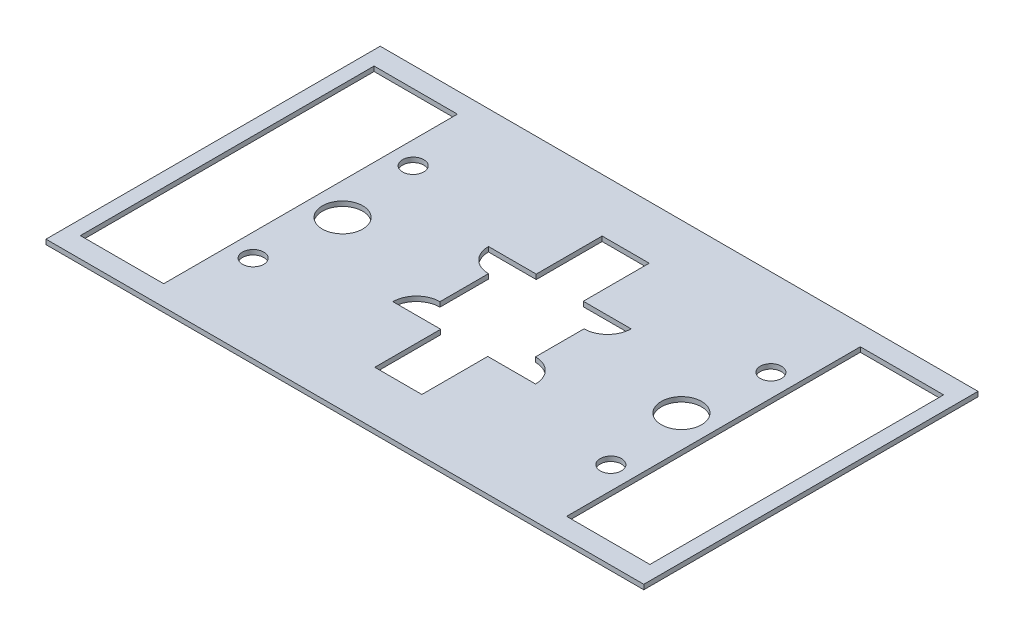
ISO-10303-21;
HEADER;
FILE_DESCRIPTION(('STEP AP214'),'2;1');
FILE_NAME('part.step','',(''),(''),'','','');
FILE_SCHEMA(('AUTOMOTIVE_DESIGN { 1 0 10303 214 1 1 1 1 }'));
ENDSEC;
DATA;
#1=APPLICATION_CONTEXT('core data for automotive mechanical design processes');
#2=APPLICATION_PROTOCOL_DEFINITION('international standard','automotive_design',2000,#1);
#3=PRODUCT_CONTEXT('',#1,'mechanical');
#4=PRODUCT('Part','Part','',(#3));
#5=PRODUCT_RELATED_PRODUCT_CATEGORY('part','',(#4));
#6=PRODUCT_DEFINITION_FORMATION('','',#4);
#7=PRODUCT_DEFINITION_CONTEXT('part definition',#1,'design');
#8=PRODUCT_DEFINITION('design','',#6,#7);
#9=PRODUCT_DEFINITION_SHAPE('','',#8);
#10=(LENGTH_UNIT() NAMED_UNIT(*) SI_UNIT(.MILLI.,.METRE.));
#11=(NAMED_UNIT(*) PLANE_ANGLE_UNIT() SI_UNIT($,.RADIAN.));
#12=(NAMED_UNIT(*) SI_UNIT($,.STERADIAN.) SOLID_ANGLE_UNIT());
#13=UNCERTAINTY_MEASURE_WITH_UNIT(LENGTH_MEASURE(1.E-05),#10,'distance_accuracy_value','');
#14=(GEOMETRIC_REPRESENTATION_CONTEXT(3) GLOBAL_UNCERTAINTY_ASSIGNED_CONTEXT((#13)) GLOBAL_UNIT_ASSIGNED_CONTEXT((#10,
#11,#12)) REPRESENTATION_CONTEXT('',''));
#15=CARTESIAN_POINT('',(0.,0.,0.));
#16=DIRECTION('',(0.,0.,1.));
#17=DIRECTION('',(1.,0.,0.));
#18=AXIS2_PLACEMENT_3D('',#15,#16,#17);
#19=CARTESIAN_POINT('',(0.,0.508,-15.6));
#20=DIRECTION('',(0.,0.,-1.));
#21=DIRECTION('',(-1.,0.,0.));
#22=AXIS2_PLACEMENT_3D('',#19,#20,#21);
#23=PLANE('',#22);
#24=DIRECTION('',(1.,0.,0.));
#25=VECTOR('',#24,1.);
#26=CARTESIAN_POINT('',(0.,0.,-15.6));
#27=LINE('',#26,#25);
#28=CARTESIAN_POINT('',(21.4,0.,-15.6));
#29=VERTEX_POINT('',#28);
#30=CARTESIAN_POINT('',(30.25,0.,-15.6));
#31=VERTEX_POINT('',#30);
#32=EDGE_CURVE('E337',#29,#31,#27,.T.);
#33=ORIENTED_EDGE('',*,*,#32,.T.);
#34=DIRECTION('',(0.,-1.,0.));
#35=VECTOR('',#34,1.);
#36=CARTESIAN_POINT('',(30.25,0.508,-15.6));
#37=LINE('',#36,#35);
#38=CARTESIAN_POINT('',(30.25,0.508,-15.6));
#39=VERTEX_POINT('',#38);
#40=EDGE_CURVE('E11',#39,#31,#37,.T.);
#41=ORIENTED_EDGE('',*,*,#40,.F.);
#42=DIRECTION('',(1.,0.,0.));
#43=VECTOR('',#42,1.);
#44=CARTESIAN_POINT('',(0.,0.508,-15.6));
#45=LINE('',#44,#43);
#46=CARTESIAN_POINT('',(21.4,0.508,-15.6));
#47=VERTEX_POINT('',#46);
#48=EDGE_CURVE('E234',#47,#39,#45,.T.);
#49=ORIENTED_EDGE('',*,*,#48,.F.);
#50=DIRECTION('',(0.,-1.,0.));
#51=VECTOR('',#50,1.);
#52=CARTESIAN_POINT('',(21.4,0.508,-15.6));
#53=LINE('',#52,#51);
#54=EDGE_CURVE('E54',#47,#29,#53,.T.);
#55=ORIENTED_EDGE('',*,*,#54,.T.);
#56=EDGE_LOOP('',(#33,#41,#49,#55));
#57=FACE_BOUND('',#56,.T.);
#58=ADVANCED_FACE('F35',(#57),#23,.F.);
#59=CARTESIAN_POINT('',(30.25,0.508,0.));
#60=DIRECTION('',(1.,0.,0.));
#61=DIRECTION('',(0.,0.,-1.));
#62=AXIS2_PLACEMENT_3D('',#59,#60,#61);
#63=PLANE('',#62);
#64=DIRECTION('',(0.,0.,1.));
#65=VECTOR('',#64,1.);
#66=CARTESIAN_POINT('',(30.25,0.,0.));
#67=LINE('',#66,#65);
#68=CARTESIAN_POINT('',(30.25,0.,15.6));
#69=VERTEX_POINT('',#68);
#70=EDGE_CURVE('E240',#31,#69,#67,.T.);
#71=ORIENTED_EDGE('',*,*,#70,.T.);
#72=DIRECTION('',(0.,-1.,0.));
#73=VECTOR('',#72,1.);
#74=CARTESIAN_POINT('',(30.25,0.508,15.6));
#75=LINE('',#74,#73);
#76=CARTESIAN_POINT('',(30.25,0.508,15.6));
#77=VERTEX_POINT('',#76);
#78=EDGE_CURVE('E45',#77,#69,#75,.T.);
#79=ORIENTED_EDGE('',*,*,#78,.F.);
#80=DIRECTION('',(0.,0.,1.));
#81=VECTOR('',#80,1.);
#82=CARTESIAN_POINT('',(30.25,0.508,0.));
#83=LINE('',#82,#81);
#84=EDGE_CURVE('E228',#39,#77,#83,.T.);
#85=ORIENTED_EDGE('',*,*,#84,.F.);
#86=ORIENTED_EDGE('',*,*,#40,.T.);
#87=EDGE_LOOP('',(#71,#79,#85,#86));
#88=FACE_BOUND('',#87,.T.);
#89=ADVANCED_FACE('F239',(#88),#63,.F.);
#90=CARTESIAN_POINT('',(0.,0.508,15.6));
#91=DIRECTION('',(0.,0.,-1.));
#92=DIRECTION('',(-1.,0.,0.));
#93=AXIS2_PLACEMENT_3D('',#90,#91,#92);
#94=PLANE('',#93);
#95=DIRECTION('',(1.,0.,0.));
#96=VECTOR('',#95,1.);
#97=CARTESIAN_POINT('',(0.,0.,15.6));
#98=LINE('',#97,#96);
#99=CARTESIAN_POINT('',(21.4,0.,15.6));
#100=VERTEX_POINT('',#99);
#101=EDGE_CURVE('E340',#100,#69,#98,.T.);
#102=ORIENTED_EDGE('',*,*,#101,.F.);
#103=DIRECTION('',(0.,-1.,0.));
#104=VECTOR('',#103,1.);
#105=CARTESIAN_POINT('',(21.4,0.508,15.6));
#106=LINE('',#105,#104);
#107=CARTESIAN_POINT('',(21.4,0.508,15.6));
#108=VERTEX_POINT('',#107);
#109=EDGE_CURVE('E140',#108,#100,#106,.T.);
#110=ORIENTED_EDGE('',*,*,#109,.F.);
#111=DIRECTION('',(1.,0.,0.));
#112=VECTOR('',#111,1.);
#113=CARTESIAN_POINT('',(0.,0.508,15.6));
#114=LINE('',#113,#112);
#115=EDGE_CURVE('E233',#108,#77,#114,.T.);
#116=ORIENTED_EDGE('',*,*,#115,.T.);
#117=ORIENTED_EDGE('',*,*,#78,.T.);
#118=EDGE_LOOP('',(#102,#110,#116,#117));
#119=FACE_BOUND('',#118,.T.);
#120=ADVANCED_FACE('F244',(#119),#94,.T.);
#121=CARTESIAN_POINT('',(0.,0.508,-15.6));
#122=DIRECTION('',(0.,0.,-1.));
#123=DIRECTION('',(-1.,0.,0.));
#124=AXIS2_PLACEMENT_3D('',#121,#122,#123);
#125=PLANE('',#124);
#126=DIRECTION('',(1.,0.,0.));
#127=VECTOR('',#126,1.);
#128=CARTESIAN_POINT('',(0.,0.,-15.6));
#129=LINE('',#128,#127);
#130=CARTESIAN_POINT('',(-30.25,0.,-15.6));
#131=VERTEX_POINT('',#130);
#132=CARTESIAN_POINT('',(-21.4,0.,-15.6));
#133=VERTEX_POINT('',#132);
#134=EDGE_CURVE('E325',#131,#133,#129,.T.);
#135=ORIENTED_EDGE('',*,*,#134,.T.);
#136=DIRECTION('',(0.,-1.,0.));
#137=VECTOR('',#136,1.);
#138=CARTESIAN_POINT('',(-21.4,0.508,-15.6));
#139=LINE('',#138,#137);
#140=CARTESIAN_POINT('',(-21.4,0.508,-15.6));
#141=VERTEX_POINT('',#140);
#142=EDGE_CURVE('E347',#141,#133,#139,.T.);
#143=ORIENTED_EDGE('',*,*,#142,.F.);
#144=DIRECTION('',(1.,0.,0.));
#145=VECTOR('',#144,1.);
#146=CARTESIAN_POINT('',(0.,0.508,-15.6));
#147=LINE('',#146,#145);
#148=CARTESIAN_POINT('',(-30.25,0.508,-15.6));
#149=VERTEX_POINT('',#148);
#150=EDGE_CURVE('E486',#149,#141,#147,.T.);
#151=ORIENTED_EDGE('',*,*,#150,.F.);
#152=DIRECTION('',(0.,-1.,0.));
#153=VECTOR('',#152,1.);
#154=CARTESIAN_POINT('',(-30.25,0.508,-15.6));
#155=LINE('',#154,#153);
#156=EDGE_CURVE('E349',#149,#131,#155,.T.);
#157=ORIENTED_EDGE('',*,*,#156,.T.);
#158=EDGE_LOOP('',(#135,#143,#151,#157));
#159=FACE_BOUND('',#158,.T.);
#160=ADVANCED_FACE('F512',(#159),#125,.F.);
#161=CARTESIAN_POINT('',(-21.4,0.508,0.));
#162=DIRECTION('',(1.,0.,0.));
#163=DIRECTION('',(0.,0.,-1.));
#164=AXIS2_PLACEMENT_3D('',#161,#162,#163);
#165=PLANE('',#164);
#166=DIRECTION('',(0.,0.,1.));
#167=VECTOR('',#166,1.);
#168=CARTESIAN_POINT('',(-21.4,0.,0.));
#169=LINE('',#168,#167);
#170=CARTESIAN_POINT('',(-21.4,0.,15.6));
#171=VERTEX_POINT('',#170);
#172=EDGE_CURVE('E328',#133,#171,#169,.T.);
#173=ORIENTED_EDGE('',*,*,#172,.T.);
#174=DIRECTION('',(0.,-1.,0.));
#175=VECTOR('',#174,1.);
#176=CARTESIAN_POINT('',(-21.4,0.508,15.6));
#177=LINE('',#176,#175);
#178=CARTESIAN_POINT('',(-21.4,0.508,15.6));
#179=VERTEX_POINT('',#178);
#180=EDGE_CURVE('E354',#179,#171,#177,.T.);
#181=ORIENTED_EDGE('',*,*,#180,.F.);
#182=DIRECTION('',(0.,0.,1.));
#183=VECTOR('',#182,1.);
#184=CARTESIAN_POINT('',(-21.4,0.508,0.));
#185=LINE('',#184,#183);
#186=EDGE_CURVE('E489',#141,#179,#185,.T.);
#187=ORIENTED_EDGE('',*,*,#186,.F.);
#188=ORIENTED_EDGE('',*,*,#142,.T.);
#189=EDGE_LOOP('',(#173,#181,#187,#188));
#190=FACE_BOUND('',#189,.T.);
#191=ADVANCED_FACE('F514',(#190),#165,.F.);
#192=CARTESIAN_POINT('',(0.,0.508,15.6));
#193=DIRECTION('',(0.,0.,-1.));
#194=DIRECTION('',(-1.,0.,0.));
#195=AXIS2_PLACEMENT_3D('',#192,#193,#194);
#196=PLANE('',#195);
#197=DIRECTION('',(1.,0.,0.));
#198=VECTOR('',#197,1.);
#199=CARTESIAN_POINT('',(0.,0.,15.6));
#200=LINE('',#199,#198);
#201=CARTESIAN_POINT('',(-30.25,0.,15.6));
#202=VERTEX_POINT('',#201);
#203=EDGE_CURVE('E331',#202,#171,#200,.T.);
#204=ORIENTED_EDGE('',*,*,#203,.F.);
#205=DIRECTION('',(0.,-1.,0.));
#206=VECTOR('',#205,1.);
#207=CARTESIAN_POINT('',(-30.25,0.508,15.6));
#208=LINE('',#207,#206);
#209=CARTESIAN_POINT('',(-30.25,0.508,15.6));
#210=VERTEX_POINT('',#209);
#211=EDGE_CURVE('E351',#210,#202,#208,.T.);
#212=ORIENTED_EDGE('',*,*,#211,.F.);
#213=DIRECTION('',(1.,0.,0.));
#214=VECTOR('',#213,1.);
#215=CARTESIAN_POINT('',(0.,0.508,15.6));
#216=LINE('',#215,#214);
#217=EDGE_CURVE('E491',#210,#179,#216,.T.);
#218=ORIENTED_EDGE('',*,*,#217,.T.);
#219=ORIENTED_EDGE('',*,*,#180,.T.);
#220=EDGE_LOOP('',(#204,#212,#218,#219));
#221=FACE_BOUND('',#220,.T.);
#222=ADVANCED_FACE('F507',(#221),#196,.T.);
#223=CARTESIAN_POINT('',(31.75,0.508,0.));
#224=DIRECTION('',(1.,0.,0.));
#225=DIRECTION('',(0.,0.,-1.));
#226=AXIS2_PLACEMENT_3D('',#223,#224,#225);
#227=PLANE('',#226);
#228=DIRECTION('',(0.,0.,1.));
#229=VECTOR('',#228,1.);
#230=CARTESIAN_POINT('',(31.75,0.,0.));
#231=LINE('',#230,#229);
#232=CARTESIAN_POINT('',(31.75,0.,-17.75));
#233=VERTEX_POINT('',#232);
#234=CARTESIAN_POINT('',(31.75,0.,17.75));
#235=VERTEX_POINT('',#234);
#236=EDGE_CURVE('E313',#233,#235,#231,.T.);
#237=ORIENTED_EDGE('',*,*,#236,.F.);
#238=DIRECTION('',(0.,-1.,0.));
#239=VECTOR('',#238,1.);
#240=CARTESIAN_POINT('',(31.75,0.508,-17.75));
#241=LINE('',#240,#239);
#242=CARTESIAN_POINT('',(31.75,0.508,-17.75));
#243=VERTEX_POINT('',#242);
#244=EDGE_CURVE('E352',#243,#233,#241,.T.);
#245=ORIENTED_EDGE('',*,*,#244,.F.);
#246=DIRECTION('',(0.,0.,1.));
#247=VECTOR('',#246,1.);
#248=CARTESIAN_POINT('',(31.75,0.508,0.));
#249=LINE('',#248,#247);
#250=CARTESIAN_POINT('',(31.75,0.508,17.75));
#251=VERTEX_POINT('',#250);
#252=EDGE_CURVE('E475',#243,#251,#249,.T.);
#253=ORIENTED_EDGE('',*,*,#252,.T.);
#254=DIRECTION('',(0.,-1.,0.));
#255=VECTOR('',#254,1.);
#256=CARTESIAN_POINT('',(31.75,0.508,17.75));
#257=LINE('',#256,#255);
#258=EDGE_CURVE('E358',#251,#235,#257,.T.);
#259=ORIENTED_EDGE('',*,*,#258,.T.);
#260=EDGE_LOOP('',(#237,#245,#253,#259));
#261=FACE_BOUND('',#260,.T.);
#262=ADVANCED_FACE('F521',(#261),#227,.T.);
#263=CARTESIAN_POINT('',(0.,0.508,-17.75));
#264=DIRECTION('',(0.,0.,-1.));
#265=DIRECTION('',(-1.,0.,0.));
#266=AXIS2_PLACEMENT_3D('',#263,#264,#265);
#267=PLANE('',#266);
#268=DIRECTION('',(1.,0.,0.));
#269=VECTOR('',#268,1.);
#270=CARTESIAN_POINT('',(0.,0.,-17.75));
#271=LINE('',#270,#269);
#272=CARTESIAN_POINT('',(-31.75,0.,-17.75));
#273=VERTEX_POINT('',#272);
#274=EDGE_CURVE('E316',#273,#233,#271,.T.);
#275=ORIENTED_EDGE('',*,*,#274,.F.);
#276=DIRECTION('',(0.,-1.,0.));
#277=VECTOR('',#276,1.);
#278=CARTESIAN_POINT('',(-31.75,0.508,-17.75));
#279=LINE('',#278,#277);
#280=CARTESIAN_POINT('',(-31.75,0.508,-17.75));
#281=VERTEX_POINT('',#280);
#282=EDGE_CURVE('E363',#281,#273,#279,.T.);
#283=ORIENTED_EDGE('',*,*,#282,.F.);
#284=DIRECTION('',(1.,0.,0.));
#285=VECTOR('',#284,1.);
#286=CARTESIAN_POINT('',(0.,0.508,-17.75));
#287=LINE('',#286,#285);
#288=EDGE_CURVE('E478',#281,#243,#287,.T.);
#289=ORIENTED_EDGE('',*,*,#288,.T.);
#290=ORIENTED_EDGE('',*,*,#244,.T.);
#291=EDGE_LOOP('',(#275,#283,#289,#290));
#292=FACE_BOUND('',#291,.T.);
#293=ADVANCED_FACE('F602',(#292),#267,.T.);
#294=CARTESIAN_POINT('',(-31.75,0.508,0.));
#295=DIRECTION('',(1.,0.,0.));
#296=DIRECTION('',(0.,0.,-1.));
#297=AXIS2_PLACEMENT_3D('',#294,#295,#296);
#298=PLANE('',#297);
#299=DIRECTION('',(0.,0.,1.));
#300=VECTOR('',#299,1.);
#301=CARTESIAN_POINT('',(-31.75,0.,0.));
#302=LINE('',#301,#300);
#303=CARTESIAN_POINT('',(-31.75,0.,17.75));
#304=VERTEX_POINT('',#303);
#305=EDGE_CURVE('E319',#273,#304,#302,.T.);
#306=ORIENTED_EDGE('',*,*,#305,.T.);
#307=DIRECTION('',(0.,-1.,0.));
#308=VECTOR('',#307,1.);
#309=CARTESIAN_POINT('',(-31.75,0.508,17.75));
#310=LINE('',#309,#308);
#311=CARTESIAN_POINT('',(-31.75,0.508,17.75));
#312=VERTEX_POINT('',#311);
#313=EDGE_CURVE('E360',#312,#304,#310,.T.);
#314=ORIENTED_EDGE('',*,*,#313,.F.);
#315=DIRECTION('',(0.,0.,1.));
#316=VECTOR('',#315,1.);
#317=CARTESIAN_POINT('',(-31.75,0.508,0.));
#318=LINE('',#317,#316);
#319=EDGE_CURVE('E481',#281,#312,#318,.T.);
#320=ORIENTED_EDGE('',*,*,#319,.F.);
#321=ORIENTED_EDGE('',*,*,#282,.T.);
#322=EDGE_LOOP('',(#306,#314,#320,#321));
#323=FACE_BOUND('',#322,.T.);
#324=ADVANCED_FACE('F598',(#323),#298,.F.);
#325=CARTESIAN_POINT('',(0.,0.508,5.075));
#326=DIRECTION('',(0.,0.,-1.));
#327=DIRECTION('',(-1.,0.,0.));
#328=AXIS2_PLACEMENT_3D('',#325,#326,#327);
#329=PLANE('',#328);
#330=DIRECTION('',(1.,0.,0.));
#331=VECTOR('',#330,1.);
#332=CARTESIAN_POINT('',(0.,0.,5.075));
#333=LINE('',#332,#331);
#334=CARTESIAN_POINT('',(-7.575,0.,5.075));
#335=VERTEX_POINT('',#334);
#336=CARTESIAN_POINT('',(-2.5,0.,5.075));
#337=VERTEX_POINT('',#336);
#338=EDGE_CURVE('E251',#335,#337,#333,.T.);
#339=ORIENTED_EDGE('',*,*,#338,.F.);
#340=DIRECTION('',(0.,-1.,0.));
#341=VECTOR('',#340,1.);
#342=CARTESIAN_POINT('',(-7.575,0.508,5.075));
#343=LINE('',#342,#341);
#344=CARTESIAN_POINT('',(-7.575,0.508,5.075));
#345=VERTEX_POINT('',#344);
#346=EDGE_CURVE('E39',#345,#335,#343,.T.);
#347=ORIENTED_EDGE('',*,*,#346,.F.);
#348=DIRECTION('',(1.,0.,0.));
#349=VECTOR('',#348,1.);
#350=CARTESIAN_POINT('',(0.,0.508,5.075));
#351=LINE('',#350,#349);
#352=CARTESIAN_POINT('',(-2.5,0.508,5.075));
#353=VERTEX_POINT('',#352);
#354=EDGE_CURVE('E345',#345,#353,#351,.T.);
#355=ORIENTED_EDGE('',*,*,#354,.T.);
#356=DIRECTION('',(0.,-1.,0.));
#357=VECTOR('',#356,1.);
#358=CARTESIAN_POINT('',(-2.5,0.508,5.075));
#359=LINE('',#358,#357);
#360=EDGE_CURVE('E247',#353,#337,#359,.T.);
#361=ORIENTED_EDGE('',*,*,#360,.T.);
#362=EDGE_LOOP('',(#339,#347,#355,#361));
#363=FACE_BOUND('',#362,.T.);
#364=ADVANCED_FACE('F37',(#363),#329,.T.);
#365=CARTESIAN_POINT('',(-5.075,0.508,5.075));
#366=DIRECTION('',(0.,-1.,0.));
#367=DIRECTION('',(0.,0.,-1.));
#368=AXIS2_PLACEMENT_3D('',#365,#366,#367);
#369=CYLINDRICAL_SURFACE('',#368,2.5);
#370=CARTESIAN_POINT('',(-5.075,0.,5.075));
#371=DIRECTION('',(0.,1.,0.));
#372=DIRECTION('',(0.,0.,1.));
#373=AXIS2_PLACEMENT_3D('',#370,#371,#372);
#374=CIRCLE('',#373,2.5);
#375=CARTESIAN_POINT('',(-5.075,0.,2.575));
#376=VERTEX_POINT('',#375);
#377=EDGE_CURVE('E254',#376,#335,#374,.T.);
#378=ORIENTED_EDGE('',*,*,#377,.F.);
#379=DIRECTION('',(0.,-1.,0.));
#380=VECTOR('',#379,1.);
#381=CARTESIAN_POINT('',(-5.075,0.508,2.575));
#382=LINE('',#381,#380);
#383=CARTESIAN_POINT('',(-5.075,0.508,2.575));
#384=VERTEX_POINT('',#383);
#385=EDGE_CURVE('E396',#384,#376,#382,.T.);
#386=ORIENTED_EDGE('',*,*,#385,.F.);
#387=CARTESIAN_POINT('',(-5.075,0.508,5.075));
#388=DIRECTION('',(0.,1.,0.));
#389=DIRECTION('',(0.,0.,1.));
#390=AXIS2_PLACEMENT_3D('',#387,#388,#389);
#391=CIRCLE('',#390,2.5);
#392=EDGE_CURVE('E405',#384,#345,#391,.T.);
#393=ORIENTED_EDGE('',*,*,#392,.T.);
#394=ORIENTED_EDGE('',*,*,#346,.T.);
#395=EDGE_LOOP('',(#378,#386,#393,#394));
#396=FACE_BOUND('',#395,.T.);
#397=ADVANCED_FACE('F403',(#396),#369,.F.);
#398=CARTESIAN_POINT('',(-5.075,0.508,0.));
#399=DIRECTION('',(1.,0.,0.));
#400=DIRECTION('',(0.,0.,-1.));
#401=AXIS2_PLACEMENT_3D('',#398,#399,#400);
#402=PLANE('',#401);
#403=DIRECTION('',(0.,0.,1.));
#404=VECTOR('',#403,1.);
#405=CARTESIAN_POINT('',(-5.075,0.,0.));
#406=LINE('',#405,#404);
#407=CARTESIAN_POINT('',(-5.075,0.,-2.575));
#408=VERTEX_POINT('',#407);
#409=EDGE_CURVE('E257',#408,#376,#406,.T.);
#410=ORIENTED_EDGE('',*,*,#409,.F.);
#411=DIRECTION('',(0.,-1.,0.));
#412=VECTOR('',#411,1.);
#413=CARTESIAN_POINT('',(-5.075,0.508,-2.575));
#414=LINE('',#413,#412);
#415=CARTESIAN_POINT('',(-5.075,0.508,-2.575));
#416=VERTEX_POINT('',#415);
#417=EDGE_CURVE('E395',#416,#408,#414,.T.);
#418=ORIENTED_EDGE('',*,*,#417,.F.);
#419=DIRECTION('',(0.,0.,1.));
#420=VECTOR('',#419,1.);
#421=CARTESIAN_POINT('',(-5.075,0.508,0.));
#422=LINE('',#421,#420);
#423=EDGE_CURVE('E414',#416,#384,#422,.T.);
#424=ORIENTED_EDGE('',*,*,#423,.T.);
#425=ORIENTED_EDGE('',*,*,#385,.T.);
#426=EDGE_LOOP('',(#410,#418,#424,#425));
#427=FACE_BOUND('',#426,.T.);
#428=ADVANCED_FACE('F412',(#427),#402,.T.);
#429=CARTESIAN_POINT('',(-5.075,0.508,-5.075));
#430=DIRECTION('',(0.,-1.,0.));
#431=DIRECTION('',(0.,0.,-1.));
#432=AXIS2_PLACEMENT_3D('',#429,#430,#431);
#433=CYLINDRICAL_SURFACE('',#432,2.5);
#434=CARTESIAN_POINT('',(-5.075,0.,-5.075));
#435=DIRECTION('',(0.,1.,0.));
#436=DIRECTION('',(0.,0.,1.));
#437=AXIS2_PLACEMENT_3D('',#434,#435,#436);
#438=CIRCLE('',#437,2.5);
#439=CARTESIAN_POINT('',(-7.575,0.,-5.075));
#440=VERTEX_POINT('',#439);
#441=EDGE_CURVE('E260',#440,#408,#438,.T.);
#442=ORIENTED_EDGE('',*,*,#441,.F.);
#443=DIRECTION('',(0.,-1.,0.));
#444=VECTOR('',#443,1.);
#445=CARTESIAN_POINT('',(-7.575,0.508,-5.075));
#446=LINE('',#445,#444);
#447=CARTESIAN_POINT('',(-7.575,0.508,-5.075));
#448=VERTEX_POINT('',#447);
#449=EDGE_CURVE('E393',#448,#440,#446,.T.);
#450=ORIENTED_EDGE('',*,*,#449,.F.);
#451=CARTESIAN_POINT('',(-5.075,0.508,-5.075));
#452=DIRECTION('',(0.,1.,0.));
#453=DIRECTION('',(0.,0.,1.));
#454=AXIS2_PLACEMENT_3D('',#451,#452,#453);
#455=CIRCLE('',#454,2.5);
#456=EDGE_CURVE('E420',#448,#416,#455,.T.);
#457=ORIENTED_EDGE('',*,*,#456,.T.);
#458=ORIENTED_EDGE('',*,*,#417,.T.);
#459=EDGE_LOOP('',(#442,#450,#457,#458));
#460=FACE_BOUND('',#459,.T.);
#461=ADVANCED_FACE('F422',(#460),#433,.F.);
#462=CARTESIAN_POINT('',(0.,0.508,-5.075));
#463=DIRECTION('',(0.,0.,-1.));
#464=DIRECTION('',(-1.,0.,0.));
#465=AXIS2_PLACEMENT_3D('',#462,#463,#464);
#466=PLANE('',#465);
#467=DIRECTION('',(1.,0.,0.));
#468=VECTOR('',#467,1.);
#469=CARTESIAN_POINT('',(0.,0.,-5.075));
#470=LINE('',#469,#468);
#471=CARTESIAN_POINT('',(-2.5,0.,-5.075));
#472=VERTEX_POINT('',#471);
#473=EDGE_CURVE('E263',#440,#472,#470,.T.);
#474=ORIENTED_EDGE('',*,*,#473,.T.);
#475=DIRECTION('',(0.,-1.,0.));
#476=VECTOR('',#475,1.);
#477=CARTESIAN_POINT('',(-2.5,0.508,-5.075));
#478=LINE('',#477,#476);
#479=CARTESIAN_POINT('',(-2.5,0.508,-5.075));
#480=VERTEX_POINT('',#479);
#481=EDGE_CURVE('E390',#480,#472,#478,.T.);
#482=ORIENTED_EDGE('',*,*,#481,.F.);
#483=DIRECTION('',(1.,0.,0.));
#484=VECTOR('',#483,1.);
#485=CARTESIAN_POINT('',(0.,0.508,-5.075));
#486=LINE('',#485,#484);
#487=EDGE_CURVE('E424',#448,#480,#486,.T.);
#488=ORIENTED_EDGE('',*,*,#487,.F.);
#489=ORIENTED_EDGE('',*,*,#449,.T.);
#490=EDGE_LOOP('',(#474,#482,#488,#489));
#491=FACE_BOUND('',#490,.T.);
#492=ADVANCED_FACE('F586',(#491),#466,.F.);
#493=CARTESIAN_POINT('',(-2.5,0.508,0.));
#494=DIRECTION('',(-1.,0.,0.));
#495=DIRECTION('',(0.,0.,1.));
#496=AXIS2_PLACEMENT_3D('',#493,#494,#495);
#497=PLANE('',#496);
#498=DIRECTION('',(0.,0.,-1.));
#499=VECTOR('',#498,1.);
#500=CARTESIAN_POINT('',(-2.5,0.,0.));
#501=LINE('',#500,#499);
#502=CARTESIAN_POINT('',(-2.5,0.,-12.075));
#503=VERTEX_POINT('',#502);
#504=EDGE_CURVE('E265',#472,#503,#501,.T.);
#505=ORIENTED_EDGE('',*,*,#504,.T.);
#506=DIRECTION('',(0.,-1.,0.));
#507=VECTOR('',#506,1.);
#508=CARTESIAN_POINT('',(-2.5,0.508,-12.075));
#509=LINE('',#508,#507);
#510=CARTESIAN_POINT('',(-2.5,0.508,-12.075));
#511=VERTEX_POINT('',#510);
#512=EDGE_CURVE('E387',#511,#503,#509,.T.);
#513=ORIENTED_EDGE('',*,*,#512,.F.);
#514=DIRECTION('',(0.,0.,-1.));
#515=VECTOR('',#514,1.);
#516=CARTESIAN_POINT('',(-2.5,0.508,0.));
#517=LINE('',#516,#515);
#518=EDGE_CURVE('E426',#480,#511,#517,.T.);
#519=ORIENTED_EDGE('',*,*,#518,.F.);
#520=ORIENTED_EDGE('',*,*,#481,.T.);
#521=EDGE_LOOP('',(#505,#513,#519,#520));
#522=FACE_BOUND('',#521,.T.);
#523=ADVANCED_FACE('F582',(#522),#497,.F.);
#524=CARTESIAN_POINT('',(0.,0.508,-12.075));
#525=DIRECTION('',(0.,0.,-1.));
#526=DIRECTION('',(-1.,0.,0.));
#527=AXIS2_PLACEMENT_3D('',#524,#525,#526);
#528=PLANE('',#527);
#529=DIRECTION('',(1.,0.,0.));
#530=VECTOR('',#529,1.);
#531=CARTESIAN_POINT('',(0.,0.,-12.075));
#532=LINE('',#531,#530);
#533=CARTESIAN_POINT('',(2.5,0.,-12.075));
#534=VERTEX_POINT('',#533);
#535=EDGE_CURVE('E267',#503,#534,#532,.T.);
#536=ORIENTED_EDGE('',*,*,#535,.T.);
#537=DIRECTION('',(0.,-1.,0.));
#538=VECTOR('',#537,1.);
#539=CARTESIAN_POINT('',(2.5,0.508,-12.075));
#540=LINE('',#539,#538);
#541=CARTESIAN_POINT('',(2.5,0.508,-12.075));
#542=VERTEX_POINT('',#541);
#543=EDGE_CURVE('E384',#542,#534,#540,.T.);
#544=ORIENTED_EDGE('',*,*,#543,.F.);
#545=DIRECTION('',(1.,0.,0.));
#546=VECTOR('',#545,1.);
#547=CARTESIAN_POINT('',(0.,0.508,-12.075));
#548=LINE('',#547,#546);
#549=EDGE_CURVE('E431',#511,#542,#548,.T.);
#550=ORIENTED_EDGE('',*,*,#549,.F.);
#551=ORIENTED_EDGE('',*,*,#512,.T.);
#552=EDGE_LOOP('',(#536,#544,#550,#551));
#553=FACE_BOUND('',#552,.T.);
#554=ADVANCED_FACE('F578',(#553),#528,.F.);
#555=CARTESIAN_POINT('',(2.5,0.508,0.));
#556=DIRECTION('',(1.,0.,0.));
#557=DIRECTION('',(0.,0.,-1.));
#558=AXIS2_PLACEMENT_3D('',#555,#556,#557);
#559=PLANE('',#558);
#560=DIRECTION('',(0.,0.,1.));
#561=VECTOR('',#560,1.);
#562=CARTESIAN_POINT('',(2.5,0.,0.));
#563=LINE('',#562,#561);
#564=CARTESIAN_POINT('',(2.5,0.,-5.075));
#565=VERTEX_POINT('',#564);
#566=EDGE_CURVE('E269',#534,#565,#563,.T.);
#567=ORIENTED_EDGE('',*,*,#566,.T.);
#568=DIRECTION('',(0.,-1.,0.));
#569=VECTOR('',#568,1.);
#570=CARTESIAN_POINT('',(2.5,0.508,-5.075));
#571=LINE('',#570,#569);
#572=CARTESIAN_POINT('',(2.5,0.508,-5.075));
#573=VERTEX_POINT('',#572);
#574=EDGE_CURVE('E381',#573,#565,#571,.T.);
#575=ORIENTED_EDGE('',*,*,#574,.F.);
#576=DIRECTION('',(0.,0.,1.));
#577=VECTOR('',#576,1.);
#578=CARTESIAN_POINT('',(2.5,0.508,0.));
#579=LINE('',#578,#577);
#580=EDGE_CURVE('E433',#542,#573,#579,.T.);
#581=ORIENTED_EDGE('',*,*,#580,.F.);
#582=ORIENTED_EDGE('',*,*,#543,.T.);
#583=EDGE_LOOP('',(#567,#575,#581,#582));
#584=FACE_BOUND('',#583,.T.);
#585=ADVANCED_FACE('F574',(#584),#559,.F.);
#586=CARTESIAN_POINT('',(0.,0.508,-5.075));
#587=DIRECTION('',(0.,0.,-1.));
#588=DIRECTION('',(-1.,0.,0.));
#589=AXIS2_PLACEMENT_3D('',#586,#587,#588);
#590=PLANE('',#589);
#591=DIRECTION('',(1.,0.,0.));
#592=VECTOR('',#591,1.);
#593=CARTESIAN_POINT('',(0.,0.,-5.075));
#594=LINE('',#593,#592);
#595=CARTESIAN_POINT('',(7.575,0.,-5.075));
#596=VERTEX_POINT('',#595);
#597=EDGE_CURVE('E271',#565,#596,#594,.T.);
#598=ORIENTED_EDGE('',*,*,#597,.T.);
#599=DIRECTION('',(0.,-1.,0.));
#600=VECTOR('',#599,1.);
#601=CARTESIAN_POINT('',(7.575,0.508,-5.075));
#602=LINE('',#601,#600);
#603=CARTESIAN_POINT('',(7.575,0.508,-5.075));
#604=VERTEX_POINT('',#603);
#605=EDGE_CURVE('E379',#604,#596,#602,.T.);
#606=ORIENTED_EDGE('',*,*,#605,.F.);
#607=DIRECTION('',(1.,0.,0.));
#608=VECTOR('',#607,1.);
#609=CARTESIAN_POINT('',(0.,0.508,-5.075));
#610=LINE('',#609,#608);
#611=EDGE_CURVE('E435',#573,#604,#610,.T.);
#612=ORIENTED_EDGE('',*,*,#611,.F.);
#613=ORIENTED_EDGE('',*,*,#574,.T.);
#614=EDGE_LOOP('',(#598,#606,#612,#613));
#615=FACE_BOUND('',#614,.T.);
#616=ADVANCED_FACE('F570',(#615),#590,.F.);
#617=CARTESIAN_POINT('',(5.075,0.508,-5.075));
#618=DIRECTION('',(0.,-1.,0.));
#619=DIRECTION('',(0.,0.,-1.));
#620=AXIS2_PLACEMENT_3D('',#617,#618,#619);
#621=CYLINDRICAL_SURFACE('',#620,2.5);
#622=CARTESIAN_POINT('',(5.075,0.,-5.075));
#623=DIRECTION('',(0.,1.,0.));
#624=DIRECTION('',(0.,0.,1.));
#625=AXIS2_PLACEMENT_3D('',#622,#623,#624);
#626=CIRCLE('',#625,2.5);
#627=CARTESIAN_POINT('',(5.075,0.,-2.575));
#628=VERTEX_POINT('',#627);
#629=EDGE_CURVE('E274',#628,#596,#626,.T.);
#630=ORIENTED_EDGE('',*,*,#629,.F.);
#631=DIRECTION('',(0.,-1.,0.));
#632=VECTOR('',#631,1.);
#633=CARTESIAN_POINT('',(5.075,0.508,-2.575));
#634=LINE('',#633,#632);
#635=CARTESIAN_POINT('',(5.075,0.508,-2.575));
#636=VERTEX_POINT('',#635);
#637=EDGE_CURVE('E377',#636,#628,#634,.T.);
#638=ORIENTED_EDGE('',*,*,#637,.F.);
#639=CARTESIAN_POINT('',(5.075,0.508,-5.075));
#640=DIRECTION('',(0.,1.,0.));
#641=DIRECTION('',(0.,0.,1.));
#642=AXIS2_PLACEMENT_3D('',#639,#640,#641);
#643=CIRCLE('',#642,2.5);
#644=EDGE_CURVE('E437',#636,#604,#643,.T.);
#645=ORIENTED_EDGE('',*,*,#644,.T.);
#646=ORIENTED_EDGE('',*,*,#605,.T.);
#647=EDGE_LOOP('',(#630,#638,#645,#646));
#648=FACE_BOUND('',#647,.T.);
#649=ADVANCED_FACE('F566',(#648),#621,.F.);
#650=CARTESIAN_POINT('',(5.075,0.508,0.));
#651=DIRECTION('',(1.,0.,0.));
#652=DIRECTION('',(0.,0.,-1.));
#653=AXIS2_PLACEMENT_3D('',#650,#651,#652);
#654=PLANE('',#653);
#655=DIRECTION('',(0.,0.,1.));
#656=VECTOR('',#655,1.);
#657=CARTESIAN_POINT('',(5.075,0.,0.));
#658=LINE('',#657,#656);
#659=CARTESIAN_POINT('',(5.075,0.,2.575));
#660=VERTEX_POINT('',#659);
#661=EDGE_CURVE('E277',#628,#660,#658,.T.);
#662=ORIENTED_EDGE('',*,*,#661,.T.);
#663=DIRECTION('',(0.,-1.,0.));
#664=VECTOR('',#663,1.);
#665=CARTESIAN_POINT('',(5.075,0.508,2.575));
#666=LINE('',#665,#664);
#667=CARTESIAN_POINT('',(5.075,0.508,2.575));
#668=VERTEX_POINT('',#667);
#669=EDGE_CURVE('E375',#668,#660,#666,.T.);
#670=ORIENTED_EDGE('',*,*,#669,.F.);
#671=DIRECTION('',(0.,0.,1.));
#672=VECTOR('',#671,1.);
#673=CARTESIAN_POINT('',(5.075,0.508,0.));
#674=LINE('',#673,#672);
#675=EDGE_CURVE('E440',#636,#668,#674,.T.);
#676=ORIENTED_EDGE('',*,*,#675,.F.);
#677=ORIENTED_EDGE('',*,*,#637,.T.);
#678=EDGE_LOOP('',(#662,#670,#676,#677));
#679=FACE_BOUND('',#678,.T.);
#680=ADVANCED_FACE('F562',(#679),#654,.F.);
#681=CARTESIAN_POINT('',(5.075,0.508,5.075));
#682=DIRECTION('',(0.,-1.,0.));
#683=DIRECTION('',(0.,0.,-1.));
#684=AXIS2_PLACEMENT_3D('',#681,#682,#683);
#685=CYLINDRICAL_SURFACE('',#684,2.5);
#686=CARTESIAN_POINT('',(5.075,0.,5.075));
#687=DIRECTION('',(0.,1.,0.));
#688=DIRECTION('',(0.,0.,1.));
#689=AXIS2_PLACEMENT_3D('',#686,#687,#688);
#690=CIRCLE('',#689,2.5);
#691=CARTESIAN_POINT('',(7.575,0.,5.075));
#692=VERTEX_POINT('',#691);
#693=EDGE_CURVE('E280',#692,#660,#690,.T.);
#694=ORIENTED_EDGE('',*,*,#693,.F.);
#695=DIRECTION('',(0.,-1.,0.));
#696=VECTOR('',#695,1.);
#697=CARTESIAN_POINT('',(7.575,0.508,5.075));
#698=LINE('',#697,#696);
#699=CARTESIAN_POINT('',(7.575,0.508,5.075));
#700=VERTEX_POINT('',#699);
#701=EDGE_CURVE('E373',#700,#692,#698,.T.);
#702=ORIENTED_EDGE('',*,*,#701,.F.);
#703=CARTESIAN_POINT('',(5.075,0.508,5.075));
#704=DIRECTION('',(0.,1.,0.));
#705=DIRECTION('',(0.,0.,1.));
#706=AXIS2_PLACEMENT_3D('',#703,#704,#705);
#707=CIRCLE('',#706,2.5);
#708=EDGE_CURVE('E442',#700,#668,#707,.T.);
#709=ORIENTED_EDGE('',*,*,#708,.T.);
#710=ORIENTED_EDGE('',*,*,#669,.T.);
#711=EDGE_LOOP('',(#694,#702,#709,#710));
#712=FACE_BOUND('',#711,.T.);
#713=ADVANCED_FACE('F558',(#712),#685,.F.);
#714=CARTESIAN_POINT('',(0.,0.508,5.075));
#715=DIRECTION('',(0.,0.,-1.));
#716=DIRECTION('',(-1.,0.,0.));
#717=AXIS2_PLACEMENT_3D('',#714,#715,#716);
#718=PLANE('',#717);
#719=DIRECTION('',(1.,0.,0.));
#720=VECTOR('',#719,1.);
#721=CARTESIAN_POINT('',(0.,0.,5.075));
#722=LINE('',#721,#720);
#723=CARTESIAN_POINT('',(2.5,0.,5.075));
#724=VERTEX_POINT('',#723);
#725=EDGE_CURVE('E283',#724,#692,#722,.T.);
#726=ORIENTED_EDGE('',*,*,#725,.F.);
#727=DIRECTION('',(0.,-1.,0.));
#728=VECTOR('',#727,1.);
#729=CARTESIAN_POINT('',(2.5,0.508,5.075));
#730=LINE('',#729,#728);
#731=CARTESIAN_POINT('',(2.5,0.508,5.075));
#732=VERTEX_POINT('',#731);
#733=EDGE_CURVE('E371',#732,#724,#730,.T.);
#734=ORIENTED_EDGE('',*,*,#733,.F.);
#735=DIRECTION('',(1.,0.,0.));
#736=VECTOR('',#735,1.);
#737=CARTESIAN_POINT('',(0.,0.508,5.075));
#738=LINE('',#737,#736);
#739=EDGE_CURVE('E445',#732,#700,#738,.T.);
#740=ORIENTED_EDGE('',*,*,#739,.T.);
#741=ORIENTED_EDGE('',*,*,#701,.T.);
#742=EDGE_LOOP('',(#726,#734,#740,#741));
#743=FACE_BOUND('',#742,.T.);
#744=ADVANCED_FACE('F548',(#743),#718,.T.);
#745=CARTESIAN_POINT('',(2.5,0.508,0.));
#746=DIRECTION('',(-1.,0.,0.));
#747=DIRECTION('',(0.,0.,1.));
#748=AXIS2_PLACEMENT_3D('',#745,#746,#747);
#749=PLANE('',#748);
#750=DIRECTION('',(0.,0.,-1.));
#751=VECTOR('',#750,1.);
#752=CARTESIAN_POINT('',(2.5,0.,0.));
#753=LINE('',#752,#751);
#754=CARTESIAN_POINT('',(2.5,0.,12.075));
#755=VERTEX_POINT('',#754);
#756=EDGE_CURVE('E286',#755,#724,#753,.T.);
#757=ORIENTED_EDGE('',*,*,#756,.F.);
#758=DIRECTION('',(0.,-1.,0.));
#759=VECTOR('',#758,1.);
#760=CARTESIAN_POINT('',(2.5,0.508,12.075));
#761=LINE('',#760,#759);
#762=CARTESIAN_POINT('',(2.5,0.508,12.075));
#763=VERTEX_POINT('',#762);
#764=EDGE_CURVE('E369',#763,#755,#761,.T.);
#765=ORIENTED_EDGE('',*,*,#764,.F.);
#766=DIRECTION('',(0.,0.,-1.));
#767=VECTOR('',#766,1.);
#768=CARTESIAN_POINT('',(2.5,0.508,0.));
#769=LINE('',#768,#767);
#770=EDGE_CURVE('E448',#763,#732,#769,.T.);
#771=ORIENTED_EDGE('',*,*,#770,.T.);
#772=ORIENTED_EDGE('',*,*,#733,.T.);
#773=EDGE_LOOP('',(#757,#765,#771,#772));
#774=FACE_BOUND('',#773,.T.);
#775=ADVANCED_FACE('F542',(#774),#749,.T.);
#776=CARTESIAN_POINT('',(0.,0.508,12.075));
#777=DIRECTION('',(0.,0.,-1.));
#778=DIRECTION('',(-1.,0.,0.));
#779=AXIS2_PLACEMENT_3D('',#776,#777,#778);
#780=PLANE('',#779);
#781=DIRECTION('',(1.,0.,0.));
#782=VECTOR('',#781,1.);
#783=CARTESIAN_POINT('',(0.,0.,12.075));
#784=LINE('',#783,#782);
#785=CARTESIAN_POINT('',(-2.5,0.,12.075));
#786=VERTEX_POINT('',#785);
#787=EDGE_CURVE('E289',#786,#755,#784,.T.);
#788=ORIENTED_EDGE('',*,*,#787,.F.);
#789=DIRECTION('',(0.,-1.,0.));
#790=VECTOR('',#789,1.);
#791=CARTESIAN_POINT('',(-2.5,0.508,12.075));
#792=LINE('',#791,#790);
#793=CARTESIAN_POINT('',(-2.5,0.508,12.075));
#794=VERTEX_POINT('',#793);
#795=EDGE_CURVE('E367',#794,#786,#792,.T.);
#796=ORIENTED_EDGE('',*,*,#795,.F.);
#797=DIRECTION('',(1.,0.,0.));
#798=VECTOR('',#797,1.);
#799=CARTESIAN_POINT('',(0.,0.508,12.075));
#800=LINE('',#799,#798);
#801=EDGE_CURVE('E451',#794,#763,#800,.T.);
#802=ORIENTED_EDGE('',*,*,#801,.T.);
#803=ORIENTED_EDGE('',*,*,#764,.T.);
#804=EDGE_LOOP('',(#788,#796,#802,#803));
#805=FACE_BOUND('',#804,.T.);
#806=ADVANCED_FACE('F534',(#805),#780,.T.);
#807=CARTESIAN_POINT('',(-30.25,0.508,0.));
#808=DIRECTION('',(1.,0.,0.));
#809=DIRECTION('',(0.,0.,-1.));
#810=AXIS2_PLACEMENT_3D('',#807,#808,#809);
#811=PLANE('',#810);
#812=DIRECTION('',(0.,0.,1.));
#813=VECTOR('',#812,1.);
#814=CARTESIAN_POINT('',(-30.25,0.,0.));
#815=LINE('',#814,#813);
#816=EDGE_CURVE('E334',#131,#202,#815,.T.);
#817=ORIENTED_EDGE('',*,*,#816,.F.);
#818=ORIENTED_EDGE('',*,*,#156,.F.);
#819=DIRECTION('',(0.,0.,1.));
#820=VECTOR('',#819,1.);
#821=CARTESIAN_POINT('',(-30.25,0.508,0.));
#822=LINE('',#821,#820);
#823=EDGE_CURVE('E494',#149,#210,#822,.T.);
#824=ORIENTED_EDGE('',*,*,#823,.T.);
#825=ORIENTED_EDGE('',*,*,#211,.T.);
#826=EDGE_LOOP('',(#817,#818,#824,#825));
#827=FACE_BOUND('',#826,.T.);
#828=ADVANCED_FACE('F499',(#827),#811,.T.);
#829=CARTESIAN_POINT('',(0.,0.508,17.75));
#830=DIRECTION('',(0.,0.,-1.));
#831=DIRECTION('',(-1.,0.,0.));
#832=AXIS2_PLACEMENT_3D('',#829,#830,#831);
#833=PLANE('',#832);
#834=DIRECTION('',(1.,0.,0.));
#835=VECTOR('',#834,1.);
#836=CARTESIAN_POINT('',(0.,0.,17.75));
#837=LINE('',#836,#835);
#838=EDGE_CURVE('E322',#304,#235,#837,.T.);
#839=ORIENTED_EDGE('',*,*,#838,.T.);
#840=ORIENTED_EDGE('',*,*,#258,.F.);
#841=DIRECTION('',(1.,0.,0.));
#842=VECTOR('',#841,1.);
#843=CARTESIAN_POINT('',(0.,0.508,17.75));
#844=LINE('',#843,#842);
#845=EDGE_CURVE('E484',#312,#251,#844,.T.);
#846=ORIENTED_EDGE('',*,*,#845,.F.);
#847=ORIENTED_EDGE('',*,*,#313,.T.);
#848=EDGE_LOOP('',(#839,#840,#846,#847));
#849=FACE_BOUND('',#848,.T.);
#850=ADVANCED_FACE('F533',(#849),#833,.F.);
#851=CARTESIAN_POINT('',(-19.,0.508,-8.5));
#852=DIRECTION('',(0.,-1.,0.));
#853=DIRECTION('',(0.,0.,-1.));
#854=AXIS2_PLACEMENT_3D('',#851,#852,#853);
#855=CYLINDRICAL_SURFACE('',#854,1.13);
#856=CARTESIAN_POINT('',(-19.,0.508,-8.5));
#857=DIRECTION('',(0.,1.,0.));
#858=DIRECTION('',(0.,0.,1.));
#859=AXIS2_PLACEMENT_3D('',#856,#857,#858);
#860=CIRCLE('',#859,1.13);
#861=CARTESIAN_POINT('',(-19.,0.508,-7.37));
#862=VERTEX_POINT('',#861);
#863=EDGE_CURVE('E472',#862,#862,#860,.T.);
#864=ORIENTED_EDGE('',*,*,#863,.T.);
#865=EDGE_LOOP('',(#864));
#866=FACE_BOUND('',#865,.T.);
#867=CARTESIAN_POINT('',(-19.,0.,-8.5));
#868=DIRECTION('',(0.,1.,0.));
#869=DIRECTION('',(0.,0.,1.));
#870=AXIS2_PLACEMENT_3D('',#867,#868,#869);
#871=CIRCLE('',#870,1.13);
#872=CARTESIAN_POINT('',(-19.,0.,-7.37));
#873=VERTEX_POINT('',#872);
#874=EDGE_CURVE('E310',#873,#873,#871,.T.);
#875=ORIENTED_EDGE('',*,*,#874,.F.);
#876=EDGE_LOOP('',(#875));
#877=FACE_BOUND('',#876,.T.);
#878=ADVANCED_FACE('F539',(#866,#877),#855,.F.);
#879=CARTESIAN_POINT('',(19.,0.508,-8.5));
#880=DIRECTION('',(0.,-1.,0.));
#881=DIRECTION('',(0.,0.,-1.));
#882=AXIS2_PLACEMENT_3D('',#879,#880,#881);
#883=CYLINDRICAL_SURFACE('',#882,1.13);
#884=CARTESIAN_POINT('',(19.,0.508,-8.5));
#885=DIRECTION('',(0.,1.,0.));
#886=DIRECTION('',(0.,0.,1.));
#887=AXIS2_PLACEMENT_3D('',#884,#885,#886);
#888=CIRCLE('',#887,1.13);
#889=CARTESIAN_POINT('',(19.,0.508,-7.37));
#890=VERTEX_POINT('',#889);
#891=EDGE_CURVE('E469',#890,#890,#888,.T.);
#892=ORIENTED_EDGE('',*,*,#891,.T.);
#893=EDGE_LOOP('',(#892));
#894=FACE_BOUND('',#893,.T.);
#895=CARTESIAN_POINT('',(19.,0.,-8.5));
#896=DIRECTION('',(0.,1.,0.));
#897=DIRECTION('',(0.,0.,1.));
#898=AXIS2_PLACEMENT_3D('',#895,#896,#897);
#899=CIRCLE('',#898,1.13);
#900=CARTESIAN_POINT('',(19.,0.,-7.37));
#901=VERTEX_POINT('',#900);
#902=EDGE_CURVE('E307',#901,#901,#899,.T.);
#903=ORIENTED_EDGE('',*,*,#902,.F.);
#904=EDGE_LOOP('',(#903));
#905=FACE_BOUND('',#904,.T.);
#906=ADVANCED_FACE('F616',(#894,#905),#883,.F.);
#907=CARTESIAN_POINT('',(19.,0.508,8.5));
#908=DIRECTION('',(0.,-1.,0.));
#909=DIRECTION('',(0.,0.,-1.));
#910=AXIS2_PLACEMENT_3D('',#907,#908,#909);
#911=CYLINDRICAL_SURFACE('',#910,1.13);
#912=CARTESIAN_POINT('',(19.,0.508,8.5));
#913=DIRECTION('',(0.,1.,0.));
#914=DIRECTION('',(0.,0.,1.));
#915=AXIS2_PLACEMENT_3D('',#912,#913,#914);
#916=CIRCLE('',#915,1.13);
#917=CARTESIAN_POINT('',(19.,0.508,9.63));
#918=VERTEX_POINT('',#917);
#919=EDGE_CURVE('E466',#918,#918,#916,.T.);
#920=ORIENTED_EDGE('',*,*,#919,.T.);
#921=EDGE_LOOP('',(#920));
#922=FACE_BOUND('',#921,.T.);
#923=CARTESIAN_POINT('',(19.,0.,8.5));
#924=DIRECTION('',(0.,1.,0.));
#925=DIRECTION('',(0.,0.,1.));
#926=AXIS2_PLACEMENT_3D('',#923,#924,#925);
#927=CIRCLE('',#926,1.13);
#928=CARTESIAN_POINT('',(19.,0.,9.63));
#929=VERTEX_POINT('',#928);
#930=EDGE_CURVE('E304',#929,#929,#927,.T.);
#931=ORIENTED_EDGE('',*,*,#930,.F.);
#932=EDGE_LOOP('',(#931));
#933=FACE_BOUND('',#932,.T.);
#934=ADVANCED_FACE('F620',(#922,#933),#911,.F.);
#935=CARTESIAN_POINT('',(-19.,0.508,8.5));
#936=DIRECTION('',(0.,-1.,0.));
#937=DIRECTION('',(0.,0.,-1.));
#938=AXIS2_PLACEMENT_3D('',#935,#936,#937);
#939=CYLINDRICAL_SURFACE('',#938,1.13);
#940=CARTESIAN_POINT('',(-19.,0.508,8.5));
#941=DIRECTION('',(0.,1.,0.));
#942=DIRECTION('',(0.,0.,1.));
#943=AXIS2_PLACEMENT_3D('',#940,#941,#942);
#944=CIRCLE('',#943,1.13);
#945=CARTESIAN_POINT('',(-19.,0.508,9.63));
#946=VERTEX_POINT('',#945);
#947=EDGE_CURVE('E463',#946,#946,#944,.T.);
#948=ORIENTED_EDGE('',*,*,#947,.T.);
#949=EDGE_LOOP('',(#948));
#950=FACE_BOUND('',#949,.T.);
#951=CARTESIAN_POINT('',(-19.,0.,8.5));
#952=DIRECTION('',(0.,1.,0.));
#953=DIRECTION('',(0.,0.,1.));
#954=AXIS2_PLACEMENT_3D('',#951,#952,#953);
#955=CIRCLE('',#954,1.13);
#956=CARTESIAN_POINT('',(-19.,0.,9.63));
#957=VERTEX_POINT('',#956);
#958=EDGE_CURVE('E301',#957,#957,#955,.T.);
#959=ORIENTED_EDGE('',*,*,#958,.F.);
#960=EDGE_LOOP('',(#959));
#961=FACE_BOUND('',#960,.T.);
#962=ADVANCED_FACE('F624',(#950,#961),#939,.F.);
#963=CARTESIAN_POINT('',(-18.,0.508,0.));
#964=DIRECTION('',(0.,-1.,0.));
#965=DIRECTION('',(0.,0.,-1.));
#966=AXIS2_PLACEMENT_3D('',#963,#964,#965);
#967=CYLINDRICAL_SURFACE('',#966,2.14460334594741);
#968=CARTESIAN_POINT('',(-18.,0.508,0.));
#969=DIRECTION('',(0.,1.,0.));
#970=DIRECTION('',(0.,0.,1.));
#971=AXIS2_PLACEMENT_3D('',#968,#969,#970);
#972=CIRCLE('',#971,2.14460334594741);
#973=CARTESIAN_POINT('',(-18.,0.508,2.14460334594741));
#974=VERTEX_POINT('',#973);
#975=EDGE_CURVE('E460',#974,#974,#972,.T.);
#976=ORIENTED_EDGE('',*,*,#975,.T.);
#977=EDGE_LOOP('',(#976));
#978=FACE_BOUND('',#977,.T.);
#979=CARTESIAN_POINT('',(-18.,0.,0.));
#980=DIRECTION('',(0.,1.,0.));
#981=DIRECTION('',(0.,0.,1.));
#982=AXIS2_PLACEMENT_3D('',#979,#980,#981);
#983=CIRCLE('',#982,2.14460334594741);
#984=CARTESIAN_POINT('',(-18.,0.,2.14460334594741));
#985=VERTEX_POINT('',#984);
#986=EDGE_CURVE('E298',#985,#985,#983,.T.);
#987=ORIENTED_EDGE('',*,*,#986,.F.);
#988=EDGE_LOOP('',(#987));
#989=FACE_BOUND('',#988,.T.);
#990=ADVANCED_FACE('F628',(#978,#989),#967,.F.);
#991=CARTESIAN_POINT('',(18.,0.508,0.));
#992=DIRECTION('',(0.,-1.,0.));
#993=DIRECTION('',(0.,0.,-1.));
#994=AXIS2_PLACEMENT_3D('',#991,#992,#993);
#995=CYLINDRICAL_SURFACE('',#994,2.14460334594741);
#996=CARTESIAN_POINT('',(18.,0.508,0.));
#997=DIRECTION('',(0.,1.,0.));
#998=DIRECTION('',(0.,0.,1.));
#999=AXIS2_PLACEMENT_3D('',#996,#997,#998);
#1000=CIRCLE('',#999,2.14460334594741);
#1001=CARTESIAN_POINT('',(18.,0.508,2.14460334594741));
#1002=VERTEX_POINT('',#1001);
#1003=EDGE_CURVE('E457',#1002,#1002,#1000,.T.);
#1004=ORIENTED_EDGE('',*,*,#1003,.T.);
#1005=EDGE_LOOP('',(#1004));
#1006=FACE_BOUND('',#1005,.T.);
#1007=CARTESIAN_POINT('',(18.,0.,0.));
#1008=DIRECTION('',(0.,1.,0.));
#1009=DIRECTION('',(0.,0.,1.));
#1010=AXIS2_PLACEMENT_3D('',#1007,#1008,#1009);
#1011=CIRCLE('',#1010,2.14460334594741);
#1012=CARTESIAN_POINT('',(18.,0.,2.14460334594741));
#1013=VERTEX_POINT('',#1012);
#1014=EDGE_CURVE('E295',#1013,#1013,#1011,.T.);
#1015=ORIENTED_EDGE('',*,*,#1014,.F.);
#1016=EDGE_LOOP('',(#1015));
#1017=FACE_BOUND('',#1016,.T.);
#1018=ADVANCED_FACE('F631',(#1006,#1017),#995,.F.);
#1019=CARTESIAN_POINT('',(-2.5,0.508,0.));
#1020=DIRECTION('',(1.,0.,0.));
#1021=DIRECTION('',(0.,0.,-1.));
#1022=AXIS2_PLACEMENT_3D('',#1019,#1020,#1021);
#1023=PLANE('',#1022);
#1024=DIRECTION('',(0.,0.,1.));
#1025=VECTOR('',#1024,1.);
#1026=CARTESIAN_POINT('',(-2.5,0.,0.));
#1027=LINE('',#1026,#1025);
#1028=EDGE_CURVE('E292',#337,#786,#1027,.T.);
#1029=ORIENTED_EDGE('',*,*,#1028,.F.);
#1030=ORIENTED_EDGE('',*,*,#360,.F.);
#1031=DIRECTION('',(0.,0.,1.));
#1032=VECTOR('',#1031,1.);
#1033=CARTESIAN_POINT('',(-2.5,0.508,0.));
#1034=LINE('',#1033,#1032);
#1035=EDGE_CURVE('E454',#353,#794,#1034,.T.);
#1036=ORIENTED_EDGE('',*,*,#1035,.T.);
#1037=ORIENTED_EDGE('',*,*,#795,.T.);
#1038=EDGE_LOOP('',(#1029,#1030,#1036,#1037));
#1039=FACE_BOUND('',#1038,.T.);
#1040=ADVANCED_FACE('F553',(#1039),#1023,.T.);
#1041=CARTESIAN_POINT('',(21.4,0.508,0.));
#1042=DIRECTION('',(1.,0.,0.));
#1043=DIRECTION('',(0.,0.,-1.));
#1044=AXIS2_PLACEMENT_3D('',#1041,#1042,#1043);
#1045=PLANE('',#1044);
#1046=DIRECTION('',(0.,0.,1.));
#1047=VECTOR('',#1046,1.);
#1048=CARTESIAN_POINT('',(21.4,0.,0.));
#1049=LINE('',#1048,#1047);
#1050=EDGE_CURVE('E342',#29,#100,#1049,.T.);
#1051=ORIENTED_EDGE('',*,*,#1050,.F.);
#1052=ORIENTED_EDGE('',*,*,#54,.F.);
#1053=DIRECTION('',(0.,0.,1.));
#1054=VECTOR('',#1053,1.);
#1055=CARTESIAN_POINT('',(21.4,0.508,0.));
#1056=LINE('',#1055,#1054);
#1057=EDGE_CURVE('E245',#47,#108,#1056,.T.);
#1058=ORIENTED_EDGE('',*,*,#1057,.T.);
#1059=ORIENTED_EDGE('',*,*,#109,.T.);
#1060=EDGE_LOOP('',(#1051,#1052,#1058,#1059));
#1061=FACE_BOUND('',#1060,.T.);
#1062=ADVANCED_FACE('F638',(#1061),#1045,.T.);
#1063=CARTESIAN_POINT('',(0.,0.508,0.));
#1064=DIRECTION('',(0.,1.,0.));
#1065=DIRECTION('',(0.,0.,1.));
#1066=AXIS2_PLACEMENT_3D('',#1063,#1064,#1065);
#1067=PLANE('',#1066);
#1068=ORIENTED_EDGE('',*,*,#354,.F.);
#1069=ORIENTED_EDGE('',*,*,#392,.F.);
#1070=ORIENTED_EDGE('',*,*,#423,.F.);
#1071=ORIENTED_EDGE('',*,*,#456,.F.);
#1072=ORIENTED_EDGE('',*,*,#487,.T.);
#1073=ORIENTED_EDGE('',*,*,#518,.T.);
#1074=ORIENTED_EDGE('',*,*,#549,.T.);
#1075=ORIENTED_EDGE('',*,*,#580,.T.);
#1076=ORIENTED_EDGE('',*,*,#611,.T.);
#1077=ORIENTED_EDGE('',*,*,#644,.F.);
#1078=ORIENTED_EDGE('',*,*,#675,.T.);
#1079=ORIENTED_EDGE('',*,*,#708,.F.);
#1080=ORIENTED_EDGE('',*,*,#739,.F.);
#1081=ORIENTED_EDGE('',*,*,#770,.F.);
#1082=ORIENTED_EDGE('',*,*,#801,.F.);
#1083=ORIENTED_EDGE('',*,*,#1035,.F.);
#1084=EDGE_LOOP('',(#1068,#1069,#1070,#1071,#1072,#1073,#1074,#1075,#1076,#1077,#1078,#1079,
#1080,#1081,#1082,#1083));
#1085=FACE_BOUND('',#1084,.T.);
#1086=ORIENTED_EDGE('',*,*,#1003,.F.);
#1087=EDGE_LOOP('',(#1086));
#1088=FACE_BOUND('',#1087,.T.);
#1089=ORIENTED_EDGE('',*,*,#975,.F.);
#1090=EDGE_LOOP('',(#1089));
#1091=FACE_BOUND('',#1090,.T.);
#1092=ORIENTED_EDGE('',*,*,#947,.F.);
#1093=EDGE_LOOP('',(#1092));
#1094=FACE_BOUND('',#1093,.T.);
#1095=ORIENTED_EDGE('',*,*,#919,.F.);
#1096=EDGE_LOOP('',(#1095));
#1097=FACE_BOUND('',#1096,.T.);
#1098=ORIENTED_EDGE('',*,*,#891,.F.);
#1099=EDGE_LOOP('',(#1098));
#1100=FACE_BOUND('',#1099,.T.);
#1101=ORIENTED_EDGE('',*,*,#863,.F.);
#1102=EDGE_LOOP('',(#1101));
#1103=FACE_BOUND('',#1102,.T.);
#1104=ORIENTED_EDGE('',*,*,#252,.F.);
#1105=ORIENTED_EDGE('',*,*,#288,.F.);
#1106=ORIENTED_EDGE('',*,*,#319,.T.);
#1107=ORIENTED_EDGE('',*,*,#845,.T.);
#1108=EDGE_LOOP('',(#1104,#1105,#1106,#1107));
#1109=FACE_BOUND('',#1108,.T.);
#1110=ORIENTED_EDGE('',*,*,#150,.T.);
#1111=ORIENTED_EDGE('',*,*,#186,.T.);
#1112=ORIENTED_EDGE('',*,*,#217,.F.);
#1113=ORIENTED_EDGE('',*,*,#823,.F.);
#1114=EDGE_LOOP('',(#1110,#1111,#1112,#1113));
#1115=FACE_BOUND('',#1114,.T.);
#1116=ORIENTED_EDGE('',*,*,#48,.T.);
#1117=ORIENTED_EDGE('',*,*,#84,.T.);
#1118=ORIENTED_EDGE('',*,*,#115,.F.);
#1119=ORIENTED_EDGE('',*,*,#1057,.F.);
#1120=EDGE_LOOP('',(#1116,#1117,#1118,#1119));
#1121=FACE_BOUND('',#1120,.T.);
#1122=ADVANCED_FACE('F230',(#1085,#1088,#1091,#1094,#1097,#1100,#1103,#1109,#1115,#1121),#1067,.T.);
#1123=CARTESIAN_POINT('',(0.,0.,0.));
#1124=DIRECTION('',(0.,1.,0.));
#1125=DIRECTION('',(0.,0.,1.));
#1126=AXIS2_PLACEMENT_3D('',#1123,#1124,#1125);
#1127=PLANE('',#1126);
#1128=ORIENTED_EDGE('',*,*,#338,.T.);
#1129=ORIENTED_EDGE('',*,*,#1028,.T.);
#1130=ORIENTED_EDGE('',*,*,#787,.T.);
#1131=ORIENTED_EDGE('',*,*,#756,.T.);
#1132=ORIENTED_EDGE('',*,*,#725,.T.);
#1133=ORIENTED_EDGE('',*,*,#693,.T.);
#1134=ORIENTED_EDGE('',*,*,#661,.F.);
#1135=ORIENTED_EDGE('',*,*,#629,.T.);
#1136=ORIENTED_EDGE('',*,*,#597,.F.);
#1137=ORIENTED_EDGE('',*,*,#566,.F.);
#1138=ORIENTED_EDGE('',*,*,#535,.F.);
#1139=ORIENTED_EDGE('',*,*,#504,.F.);
#1140=ORIENTED_EDGE('',*,*,#473,.F.);
#1141=ORIENTED_EDGE('',*,*,#441,.T.);
#1142=ORIENTED_EDGE('',*,*,#409,.T.);
#1143=ORIENTED_EDGE('',*,*,#377,.T.);
#1144=EDGE_LOOP('',(#1128,#1129,#1130,#1131,#1132,#1133,#1134,#1135,#1136,#1137,#1138,#1139,
#1140,#1141,#1142,#1143));
#1145=FACE_BOUND('',#1144,.T.);
#1146=ORIENTED_EDGE('',*,*,#1014,.T.);
#1147=EDGE_LOOP('',(#1146));
#1148=FACE_BOUND('',#1147,.T.);
#1149=ORIENTED_EDGE('',*,*,#986,.T.);
#1150=EDGE_LOOP('',(#1149));
#1151=FACE_BOUND('',#1150,.T.);
#1152=ORIENTED_EDGE('',*,*,#958,.T.);
#1153=EDGE_LOOP('',(#1152));
#1154=FACE_BOUND('',#1153,.T.);
#1155=ORIENTED_EDGE('',*,*,#930,.T.);
#1156=EDGE_LOOP('',(#1155));
#1157=FACE_BOUND('',#1156,.T.);
#1158=ORIENTED_EDGE('',*,*,#902,.T.);
#1159=EDGE_LOOP('',(#1158));
#1160=FACE_BOUND('',#1159,.T.);
#1161=ORIENTED_EDGE('',*,*,#874,.T.);
#1162=EDGE_LOOP('',(#1161));
#1163=FACE_BOUND('',#1162,.T.);
#1164=ORIENTED_EDGE('',*,*,#236,.T.);
#1165=ORIENTED_EDGE('',*,*,#838,.F.);
#1166=ORIENTED_EDGE('',*,*,#305,.F.);
#1167=ORIENTED_EDGE('',*,*,#274,.T.);
#1168=EDGE_LOOP('',(#1164,#1165,#1166,#1167));
#1169=FACE_BOUND('',#1168,.T.);
#1170=ORIENTED_EDGE('',*,*,#134,.F.);
#1171=ORIENTED_EDGE('',*,*,#816,.T.);
#1172=ORIENTED_EDGE('',*,*,#203,.T.);
#1173=ORIENTED_EDGE('',*,*,#172,.F.);
#1174=EDGE_LOOP('',(#1170,#1171,#1172,#1173));
#1175=FACE_BOUND('',#1174,.T.);
#1176=ORIENTED_EDGE('',*,*,#32,.F.);
#1177=ORIENTED_EDGE('',*,*,#1050,.T.);
#1178=ORIENTED_EDGE('',*,*,#101,.T.);
#1179=ORIENTED_EDGE('',*,*,#70,.F.);
#1180=EDGE_LOOP('',(#1176,#1177,#1178,#1179));
#1181=FACE_BOUND('',#1180,.T.);
#1182=ADVANCED_FACE('F408',(#1145,#1148,#1151,#1154,#1157,#1160,#1163,#1169,#1175,#1181),#1127,.F.);
#1183=CLOSED_SHELL('',(#58,#89,#120,#160,#191,#222,#262,#293,#324,#364,#397,#428,#461,#492,#523,
#554,#585,#616,#649,#680,#713,#744,#775,#806,#828,#850,#878,#906,#934,#962,#990,#1018,#1040,
#1062,#1122,#1182));
#1184=MANIFOLD_SOLID_BREP('B2',#1183);
#1185=ADVANCED_BREP_SHAPE_REPRESENTATION('',(#18,#1184),#14);
#1186=SHAPE_DEFINITION_REPRESENTATION(#9,#1185);
ENDSEC;
END-ISO-10303-21;
